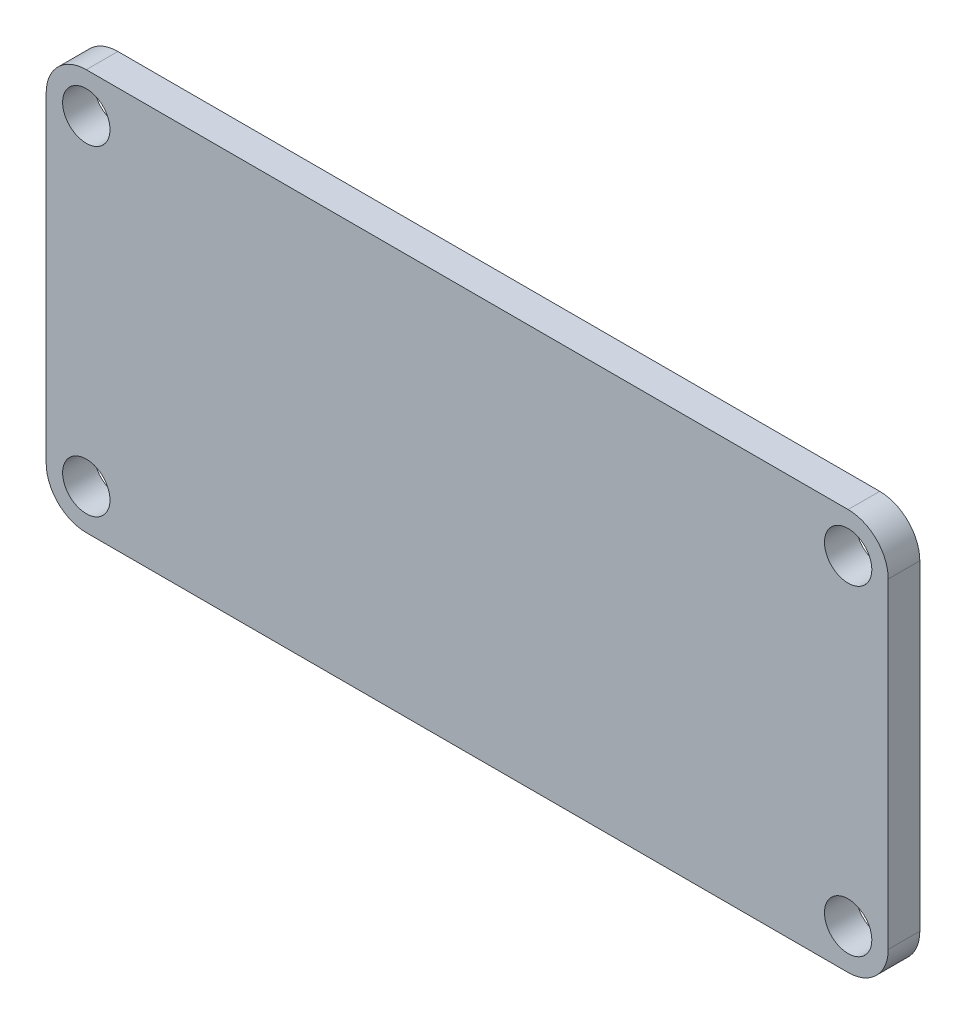
ISO-10303-21;
HEADER;
FILE_DESCRIPTION(('STEP AP214'),'2;1');
FILE_NAME('part.step','',(''),(''),'','','');
FILE_SCHEMA(('AUTOMOTIVE_DESIGN { 1 0 10303 214 1 1 1 1 }'));
ENDSEC;
DATA;
#1=APPLICATION_CONTEXT('core data for automotive mechanical design processes');
#2=APPLICATION_PROTOCOL_DEFINITION('international standard','automotive_design',2000,#1);
#3=PRODUCT_CONTEXT('',#1,'mechanical');
#4=PRODUCT('Part','Part','',(#3));
#5=PRODUCT_RELATED_PRODUCT_CATEGORY('part','',(#4));
#6=PRODUCT_DEFINITION_FORMATION('','',#4);
#7=PRODUCT_DEFINITION_CONTEXT('part definition',#1,'design');
#8=PRODUCT_DEFINITION('design','',#6,#7);
#9=PRODUCT_DEFINITION_SHAPE('','',#8);
#10=(LENGTH_UNIT() NAMED_UNIT(*) SI_UNIT(.MILLI.,.METRE.));
#11=(NAMED_UNIT(*) PLANE_ANGLE_UNIT() SI_UNIT($,.RADIAN.));
#12=(NAMED_UNIT(*) SI_UNIT($,.STERADIAN.) SOLID_ANGLE_UNIT());
#13=UNCERTAINTY_MEASURE_WITH_UNIT(LENGTH_MEASURE(1.E-05),#10,'distance_accuracy_value','');
#14=(GEOMETRIC_REPRESENTATION_CONTEXT(3) GLOBAL_UNCERTAINTY_ASSIGNED_CONTEXT((#13)) GLOBAL_UNIT_ASSIGNED_CONTEXT((#10,
#11,#12)) REPRESENTATION_CONTEXT('',''));
#15=CARTESIAN_POINT('',(0.,0.,0.));
#16=DIRECTION('',(0.,0.,1.));
#17=DIRECTION('',(1.,0.,0.));
#18=AXIS2_PLACEMENT_3D('',#15,#16,#17);
#19=CARTESIAN_POINT('',(50.8,22.86,2.));
#20=DIRECTION('',(0.,0.,-1.));
#21=DIRECTION('',(-1.,0.,0.));
#22=AXIS2_PLACEMENT_3D('',#19,#20,#21);
#23=PLANE('',#22);
#24=CARTESIAN_POINT('',(50.8,22.86,2.));
#25=DIRECTION('',(0.,0.,1.));
#26=DIRECTION('',(-1.,0.,0.));
#27=AXIS2_PLACEMENT_3D('',#24,#25,#26);
#28=CIRCLE('',#27,2.54);
#29=CARTESIAN_POINT('',(53.34,22.86,2.));
#30=VERTEX_POINT('',#29);
#31=CARTESIAN_POINT('',(50.8,25.4,2.));
#32=VERTEX_POINT('',#31);
#33=EDGE_CURVE('E164',#30,#32,#28,.T.);
#34=ORIENTED_EDGE('',*,*,#33,.T.);
#35=DIRECTION('',(-1.,0.,0.));
#36=VECTOR('',#35,1.);
#37=CARTESIAN_POINT('',(2.54,25.4,2.));
#38=LINE('',#37,#36);
#39=CARTESIAN_POINT('',(2.54,25.4,2.));
#40=VERTEX_POINT('',#39);
#41=EDGE_CURVE('E100',#32,#40,#38,.T.);
#42=ORIENTED_EDGE('',*,*,#41,.T.);
#43=CARTESIAN_POINT('',(2.54,22.86,2.));
#44=DIRECTION('',(0.,0.,1.));
#45=DIRECTION('',(-1.,0.,0.));
#46=AXIS2_PLACEMENT_3D('',#43,#44,#45);
#47=CIRCLE('',#46,2.54);
#48=CARTESIAN_POINT('',(0.,22.86,2.));
#49=VERTEX_POINT('',#48);
#50=EDGE_CURVE('E185',#40,#49,#47,.T.);
#51=ORIENTED_EDGE('',*,*,#50,.T.);
#52=DIRECTION('',(0.,-1.,0.));
#53=VECTOR('',#52,1.);
#54=CARTESIAN_POINT('',(0.,2.54000000000002,2.));
#55=LINE('',#54,#53);
#56=CARTESIAN_POINT('',(0.,2.54000000000002,2.));
#57=VERTEX_POINT('',#56);
#58=EDGE_CURVE('E199',#49,#57,#55,.T.);
#59=ORIENTED_EDGE('',*,*,#58,.T.);
#60=CARTESIAN_POINT('',(2.54,2.54,2.));
#61=DIRECTION('',(0.,0.,1.));
#62=DIRECTION('',(1.,0.,0.));
#63=AXIS2_PLACEMENT_3D('',#60,#61,#62);
#64=CIRCLE('',#63,2.54);
#65=CARTESIAN_POINT('',(2.54000000000002,0.,2.));
#66=VERTEX_POINT('',#65);
#67=EDGE_CURVE('E119',#57,#66,#64,.T.);
#68=ORIENTED_EDGE('',*,*,#67,.T.);
#69=DIRECTION('',(1.,0.,0.));
#70=VECTOR('',#69,1.);
#71=CARTESIAN_POINT('',(2.54000000000002,0.,2.));
#72=LINE('',#71,#70);
#73=CARTESIAN_POINT('',(50.8,0.,2.));
#74=VERTEX_POINT('',#73);
#75=EDGE_CURVE('E113',#66,#74,#72,.T.);
#76=ORIENTED_EDGE('',*,*,#75,.T.);
#77=CARTESIAN_POINT('',(50.8,2.54,2.));
#78=DIRECTION('',(0.,0.,1.));
#79=DIRECTION('',(-1.,0.,0.));
#80=AXIS2_PLACEMENT_3D('',#77,#78,#79);
#81=CIRCLE('',#80,2.54);
#82=CARTESIAN_POINT('',(53.34,2.54,2.));
#83=VERTEX_POINT('',#82);
#84=EDGE_CURVE('E117',#74,#83,#81,.T.);
#85=ORIENTED_EDGE('',*,*,#84,.T.);
#86=DIRECTION('',(0.,1.,0.));
#87=VECTOR('',#86,1.);
#88=CARTESIAN_POINT('',(53.34,2.54,2.));
#89=LINE('',#88,#87);
#90=EDGE_CURVE('E57',#83,#30,#89,.T.);
#91=ORIENTED_EDGE('',*,*,#90,.T.);
#92=EDGE_LOOP('',(#34,#42,#51,#59,#68,#76,#85,#91));
#93=FACE_BOUND('',#92,.T.);
#94=CARTESIAN_POINT('',(50.8,22.86,2.));
#95=DIRECTION('',(0.,0.,1.));
#96=DIRECTION('',(1.,0.,0.));
#97=AXIS2_PLACEMENT_3D('',#94,#95,#96);
#98=CIRCLE('',#97,1.5);
#99=CARTESIAN_POINT('',(52.3,22.86,2.));
#100=VERTEX_POINT('',#99);
#101=EDGE_CURVE('E146',#100,#100,#98,.T.);
#102=ORIENTED_EDGE('',*,*,#101,.F.);
#103=EDGE_LOOP('',(#102));
#104=FACE_BOUND('',#103,.T.);
#105=CARTESIAN_POINT('',(2.54,22.86,2.));
#106=DIRECTION('',(0.,0.,1.));
#107=DIRECTION('',(1.,0.,0.));
#108=AXIS2_PLACEMENT_3D('',#105,#106,#107);
#109=CIRCLE('',#108,1.5);
#110=CARTESIAN_POINT('',(4.04,22.86,2.));
#111=VERTEX_POINT('',#110);
#112=EDGE_CURVE('E213',#111,#111,#109,.T.);
#113=ORIENTED_EDGE('',*,*,#112,.F.);
#114=EDGE_LOOP('',(#113));
#115=FACE_BOUND('',#114,.T.);
#116=CARTESIAN_POINT('',(50.8,2.54,2.));
#117=DIRECTION('',(0.,0.,1.));
#118=DIRECTION('',(1.,0.,0.));
#119=AXIS2_PLACEMENT_3D('',#116,#117,#118);
#120=CIRCLE('',#119,1.5);
#121=CARTESIAN_POINT('',(52.3,2.54,2.));
#122=VERTEX_POINT('',#121);
#123=EDGE_CURVE('E221',#122,#122,#120,.T.);
#124=ORIENTED_EDGE('',*,*,#123,.F.);
#125=EDGE_LOOP('',(#124));
#126=FACE_BOUND('',#125,.T.);
#127=CARTESIAN_POINT('',(2.54,2.54,2.));
#128=DIRECTION('',(0.,0.,1.));
#129=DIRECTION('',(1.,0.,0.));
#130=AXIS2_PLACEMENT_3D('',#127,#128,#129);
#131=CIRCLE('',#130,1.5);
#132=CARTESIAN_POINT('',(4.04,2.54,2.));
#133=VERTEX_POINT('',#132);
#134=EDGE_CURVE('E229',#133,#133,#131,.T.);
#135=ORIENTED_EDGE('',*,*,#134,.F.);
#136=EDGE_LOOP('',(#135));
#137=FACE_BOUND('',#136,.T.);
#138=ADVANCED_FACE('F39',(#93,#104,#115,#126,#137),#23,.F.);
#139=CARTESIAN_POINT('',(50.8,22.86,0.));
#140=DIRECTION('',(0.,0.,-1.));
#141=DIRECTION('',(-1.,0.,0.));
#142=AXIS2_PLACEMENT_3D('',#139,#140,#141);
#143=PLANE('',#142);
#144=CARTESIAN_POINT('',(50.8,2.54,0.));
#145=DIRECTION('',(0.,0.,1.));
#146=DIRECTION('',(1.,0.,0.));
#147=AXIS2_PLACEMENT_3D('',#144,#145,#146);
#148=CIRCLE('',#147,1.5);
#149=CARTESIAN_POINT('',(52.3,2.54,0.));
#150=VERTEX_POINT('',#149);
#151=EDGE_CURVE('E225',#150,#150,#148,.T.);
#152=ORIENTED_EDGE('',*,*,#151,.T.);
#153=EDGE_LOOP('',(#152));
#154=FACE_BOUND('',#153,.T.);
#155=CARTESIAN_POINT('',(50.8,22.86,0.));
#156=DIRECTION('',(0.,0.,1.));
#157=DIRECTION('',(1.,0.,0.));
#158=AXIS2_PLACEMENT_3D('',#155,#156,#157);
#159=CIRCLE('',#158,1.5);
#160=CARTESIAN_POINT('',(52.3,22.86,0.));
#161=VERTEX_POINT('',#160);
#162=EDGE_CURVE('E209',#161,#161,#159,.T.);
#163=ORIENTED_EDGE('',*,*,#162,.T.);
#164=EDGE_LOOP('',(#163));
#165=FACE_BOUND('',#164,.T.);
#166=CARTESIAN_POINT('',(50.8,22.86,0.));
#167=DIRECTION('',(0.,0.,1.));
#168=DIRECTION('',(-1.,0.,0.));
#169=AXIS2_PLACEMENT_3D('',#166,#167,#168);
#170=CIRCLE('',#169,2.54);
#171=CARTESIAN_POINT('',(53.34,22.86,0.));
#172=VERTEX_POINT('',#171);
#173=CARTESIAN_POINT('',(50.8,25.4,0.));
#174=VERTEX_POINT('',#173);
#175=EDGE_CURVE('E141',#172,#174,#170,.T.);
#176=ORIENTED_EDGE('',*,*,#175,.F.);
#177=DIRECTION('',(0.,1.,0.));
#178=VECTOR('',#177,1.);
#179=CARTESIAN_POINT('',(53.34,2.54,0.));
#180=LINE('',#179,#178);
#181=CARTESIAN_POINT('',(53.34,2.54,0.));
#182=VERTEX_POINT('',#181);
#183=EDGE_CURVE('E92',#182,#172,#180,.T.);
#184=ORIENTED_EDGE('',*,*,#183,.F.);
#185=CARTESIAN_POINT('',(50.8,2.54,0.));
#186=DIRECTION('',(0.,0.,1.));
#187=DIRECTION('',(-1.,0.,0.));
#188=AXIS2_PLACEMENT_3D('',#185,#186,#187);
#189=CIRCLE('',#188,2.54);
#190=CARTESIAN_POINT('',(50.8,0.,0.));
#191=VERTEX_POINT('',#190);
#192=EDGE_CURVE('E86',#191,#182,#189,.T.);
#193=ORIENTED_EDGE('',*,*,#192,.F.);
#194=DIRECTION('',(1.,0.,0.));
#195=VECTOR('',#194,1.);
#196=CARTESIAN_POINT('',(2.54000000000002,0.,0.));
#197=LINE('',#196,#195);
#198=CARTESIAN_POINT('',(2.54000000000002,0.,0.));
#199=VERTEX_POINT('',#198);
#200=EDGE_CURVE('E128',#199,#191,#197,.T.);
#201=ORIENTED_EDGE('',*,*,#200,.F.);
#202=CARTESIAN_POINT('',(2.54,2.54,0.));
#203=DIRECTION('',(0.,0.,1.));
#204=DIRECTION('',(1.,0.,0.));
#205=AXIS2_PLACEMENT_3D('',#202,#203,#204);
#206=CIRCLE('',#205,2.54);
#207=CARTESIAN_POINT('',(0.,2.54000000000002,0.));
#208=VERTEX_POINT('',#207);
#209=EDGE_CURVE('E155',#208,#199,#206,.T.);
#210=ORIENTED_EDGE('',*,*,#209,.F.);
#211=DIRECTION('',(0.,-1.,0.));
#212=VECTOR('',#211,1.);
#213=CARTESIAN_POINT('',(0.,2.54000000000002,0.));
#214=LINE('',#213,#212);
#215=CARTESIAN_POINT('',(0.,22.86,0.));
#216=VERTEX_POINT('',#215);
#217=EDGE_CURVE('E152',#216,#208,#214,.T.);
#218=ORIENTED_EDGE('',*,*,#217,.F.);
#219=CARTESIAN_POINT('',(2.54,22.86,0.));
#220=DIRECTION('',(0.,0.,1.));
#221=DIRECTION('',(-1.,0.,0.));
#222=AXIS2_PLACEMENT_3D('',#219,#220,#221);
#223=CIRCLE('',#222,2.54);
#224=CARTESIAN_POINT('',(2.54,25.4,0.));
#225=VERTEX_POINT('',#224);
#226=EDGE_CURVE('E149',#225,#216,#223,.T.);
#227=ORIENTED_EDGE('',*,*,#226,.F.);
#228=DIRECTION('',(-1.,0.,0.));
#229=VECTOR('',#228,1.);
#230=CARTESIAN_POINT('',(2.54,25.4,0.));
#231=LINE('',#230,#229);
#232=EDGE_CURVE('E145',#174,#225,#231,.T.);
#233=ORIENTED_EDGE('',*,*,#232,.F.);
#234=EDGE_LOOP('',(#176,#184,#193,#201,#210,#218,#227,#233));
#235=FACE_BOUND('',#234,.T.);
#236=CARTESIAN_POINT('',(2.54,22.86,0.));
#237=DIRECTION('',(0.,0.,1.));
#238=DIRECTION('',(1.,0.,0.));
#239=AXIS2_PLACEMENT_3D('',#236,#237,#238);
#240=CIRCLE('',#239,1.5);
#241=CARTESIAN_POINT('',(4.04,22.86,0.));
#242=VERTEX_POINT('',#241);
#243=EDGE_CURVE('E217',#242,#242,#240,.T.);
#244=ORIENTED_EDGE('',*,*,#243,.T.);
#245=EDGE_LOOP('',(#244));
#246=FACE_BOUND('',#245,.T.);
#247=CARTESIAN_POINT('',(2.54,2.54,0.));
#248=DIRECTION('',(0.,0.,1.));
#249=DIRECTION('',(1.,0.,0.));
#250=AXIS2_PLACEMENT_3D('',#247,#248,#249);
#251=CIRCLE('',#250,1.5);
#252=CARTESIAN_POINT('',(4.04,2.54,0.));
#253=VERTEX_POINT('',#252);
#254=EDGE_CURVE('E233',#253,#253,#251,.T.);
#255=ORIENTED_EDGE('',*,*,#254,.T.);
#256=EDGE_LOOP('',(#255));
#257=FACE_BOUND('',#256,.T.);
#258=ADVANCED_FACE('F189',(#154,#165,#235,#246,#257),#143,.T.);
#259=CARTESIAN_POINT('',(50.8,22.86,2.));
#260=DIRECTION('',(0.,0.,-1.));
#261=DIRECTION('',(-1.,0.,0.));
#262=AXIS2_PLACEMENT_3D('',#259,#260,#261);
#263=CYLINDRICAL_SURFACE('',#262,2.54);
#264=ORIENTED_EDGE('',*,*,#175,.T.);
#265=DIRECTION('',(0.,0.,-1.));
#266=VECTOR('',#265,1.);
#267=CARTESIAN_POINT('',(50.8,25.4,2.));
#268=LINE('',#267,#266);
#269=EDGE_CURVE('E11',#32,#174,#268,.T.);
#270=ORIENTED_EDGE('',*,*,#269,.F.);
#271=ORIENTED_EDGE('',*,*,#33,.F.);
#272=DIRECTION('',(0.,0.,-1.));
#273=VECTOR('',#272,1.);
#274=CARTESIAN_POINT('',(53.34,22.86,2.));
#275=LINE('',#274,#273);
#276=EDGE_CURVE('E137',#30,#172,#275,.T.);
#277=ORIENTED_EDGE('',*,*,#276,.T.);
#278=EDGE_LOOP('',(#264,#270,#271,#277));
#279=FACE_BOUND('',#278,.T.);
#280=ADVANCED_FACE('F41',(#279),#263,.T.);
#281=CARTESIAN_POINT('',(2.54,25.4,2.));
#282=DIRECTION('',(0.,-1.,0.));
#283=DIRECTION('',(0.,0.,-1.));
#284=AXIS2_PLACEMENT_3D('',#281,#282,#283);
#285=PLANE('',#284);
#286=ORIENTED_EDGE('',*,*,#232,.T.);
#287=DIRECTION('',(0.,0.,-1.));
#288=VECTOR('',#287,1.);
#289=CARTESIAN_POINT('',(2.54,25.4,2.));
#290=LINE('',#289,#288);
#291=EDGE_CURVE('E49',#40,#225,#290,.T.);
#292=ORIENTED_EDGE('',*,*,#291,.F.);
#293=ORIENTED_EDGE('',*,*,#41,.F.);
#294=ORIENTED_EDGE('',*,*,#269,.T.);
#295=EDGE_LOOP('',(#286,#292,#293,#294));
#296=FACE_BOUND('',#295,.T.);
#297=ADVANCED_FACE('F267',(#296),#285,.F.);
#298=CARTESIAN_POINT('',(2.54,22.86,2.));
#299=DIRECTION('',(0.,0.,-1.));
#300=DIRECTION('',(-1.,0.,0.));
#301=AXIS2_PLACEMENT_3D('',#298,#299,#300);
#302=CYLINDRICAL_SURFACE('',#301,2.54);
#303=ORIENTED_EDGE('',*,*,#226,.T.);
#304=DIRECTION('',(0.,0.,-1.));
#305=VECTOR('',#304,1.);
#306=CARTESIAN_POINT('',(0.,22.86,2.));
#307=LINE('',#306,#305);
#308=EDGE_CURVE('E175',#49,#216,#307,.T.);
#309=ORIENTED_EDGE('',*,*,#308,.F.);
#310=ORIENTED_EDGE('',*,*,#50,.F.);
#311=ORIENTED_EDGE('',*,*,#291,.T.);
#312=EDGE_LOOP('',(#303,#309,#310,#311));
#313=FACE_BOUND('',#312,.T.);
#314=ADVANCED_FACE('F183',(#313),#302,.T.);
#315=CARTESIAN_POINT('',(0.,2.54000000000002,2.));
#316=DIRECTION('',(1.,0.,0.));
#317=DIRECTION('',(0.,0.,-1.));
#318=AXIS2_PLACEMENT_3D('',#315,#316,#317);
#319=PLANE('',#318);
#320=ORIENTED_EDGE('',*,*,#217,.T.);
#321=DIRECTION('',(0.,0.,-1.));
#322=VECTOR('',#321,1.);
#323=CARTESIAN_POINT('',(0.,2.54000000000002,2.));
#324=LINE('',#323,#322);
#325=EDGE_CURVE('E171',#57,#208,#324,.T.);
#326=ORIENTED_EDGE('',*,*,#325,.F.);
#327=ORIENTED_EDGE('',*,*,#58,.F.);
#328=ORIENTED_EDGE('',*,*,#308,.T.);
#329=EDGE_LOOP('',(#320,#326,#327,#328));
#330=FACE_BOUND('',#329,.T.);
#331=ADVANCED_FACE('F194',(#330),#319,.F.);
#332=CARTESIAN_POINT('',(2.54,2.54,2.));
#333=DIRECTION('',(0.,0.,-1.));
#334=DIRECTION('',(-1.,0.,0.));
#335=AXIS2_PLACEMENT_3D('',#332,#333,#334);
#336=CYLINDRICAL_SURFACE('',#335,2.54);
#337=ORIENTED_EDGE('',*,*,#209,.T.);
#338=DIRECTION('',(0.,0.,-1.));
#339=VECTOR('',#338,1.);
#340=CARTESIAN_POINT('',(2.54000000000002,0.,2.));
#341=LINE('',#340,#339);
#342=EDGE_CURVE('E130',#66,#199,#341,.T.);
#343=ORIENTED_EDGE('',*,*,#342,.F.);
#344=ORIENTED_EDGE('',*,*,#67,.F.);
#345=ORIENTED_EDGE('',*,*,#325,.T.);
#346=EDGE_LOOP('',(#337,#343,#344,#345));
#347=FACE_BOUND('',#346,.T.);
#348=ADVANCED_FACE('F197',(#347),#336,.T.);
#349=CARTESIAN_POINT('',(2.54000000000002,0.,2.));
#350=DIRECTION('',(0.,1.,0.));
#351=DIRECTION('',(0.,0.,1.));
#352=AXIS2_PLACEMENT_3D('',#349,#350,#351);
#353=PLANE('',#352);
#354=ORIENTED_EDGE('',*,*,#200,.T.);
#355=DIRECTION('',(0.,0.,-1.));
#356=VECTOR('',#355,1.);
#357=CARTESIAN_POINT('',(50.8,0.,2.));
#358=LINE('',#357,#356);
#359=EDGE_CURVE('E125',#74,#191,#358,.T.);
#360=ORIENTED_EDGE('',*,*,#359,.F.);
#361=ORIENTED_EDGE('',*,*,#75,.F.);
#362=ORIENTED_EDGE('',*,*,#342,.T.);
#363=EDGE_LOOP('',(#354,#360,#361,#362));
#364=FACE_BOUND('',#363,.T.);
#365=ADVANCED_FACE('F126',(#364),#353,.F.);
#366=CARTESIAN_POINT('',(50.8,2.54,2.));
#367=DIRECTION('',(0.,0.,-1.));
#368=DIRECTION('',(-1.,0.,0.));
#369=AXIS2_PLACEMENT_3D('',#366,#367,#368);
#370=CYLINDRICAL_SURFACE('',#369,2.54);
#371=ORIENTED_EDGE('',*,*,#192,.T.);
#372=DIRECTION('',(0.,0.,-1.));
#373=VECTOR('',#372,1.);
#374=CARTESIAN_POINT('',(53.34,2.54,2.));
#375=LINE('',#374,#373);
#376=EDGE_CURVE('E131',#83,#182,#375,.T.);
#377=ORIENTED_EDGE('',*,*,#376,.F.);
#378=ORIENTED_EDGE('',*,*,#84,.F.);
#379=ORIENTED_EDGE('',*,*,#359,.T.);
#380=EDGE_LOOP('',(#371,#377,#378,#379));
#381=FACE_BOUND('',#380,.T.);
#382=ADVANCED_FACE('F133',(#381),#370,.T.);
#383=CARTESIAN_POINT('',(53.34,2.54,2.));
#384=DIRECTION('',(-1.,0.,0.));
#385=DIRECTION('',(0.,0.,1.));
#386=AXIS2_PLACEMENT_3D('',#383,#384,#385);
#387=PLANE('',#386);
#388=ORIENTED_EDGE('',*,*,#183,.T.);
#389=ORIENTED_EDGE('',*,*,#276,.F.);
#390=ORIENTED_EDGE('',*,*,#90,.F.);
#391=ORIENTED_EDGE('',*,*,#376,.T.);
#392=EDGE_LOOP('',(#388,#389,#390,#391));
#393=FACE_BOUND('',#392,.T.);
#394=ADVANCED_FACE('F255',(#393),#387,.F.);
#395=CARTESIAN_POINT('',(50.8,22.86,2.));
#396=DIRECTION('',(0.,0.,-1.));
#397=DIRECTION('',(-1.,0.,0.));
#398=AXIS2_PLACEMENT_3D('',#395,#396,#397);
#399=CYLINDRICAL_SURFACE('',#398,1.5);
#400=ORIENTED_EDGE('',*,*,#101,.T.);
#401=EDGE_LOOP('',(#400));
#402=FACE_BOUND('',#401,.T.);
#403=ORIENTED_EDGE('',*,*,#162,.F.);
#404=EDGE_LOOP('',(#403));
#405=FACE_BOUND('',#404,.T.);
#406=ADVANCED_FACE('F252',(#402,#405),#399,.F.);
#407=CARTESIAN_POINT('',(2.54,22.86,2.));
#408=DIRECTION('',(0.,0.,-1.));
#409=DIRECTION('',(-1.,0.,0.));
#410=AXIS2_PLACEMENT_3D('',#407,#408,#409);
#411=CYLINDRICAL_SURFACE('',#410,1.5);
#412=ORIENTED_EDGE('',*,*,#112,.T.);
#413=EDGE_LOOP('',(#412));
#414=FACE_BOUND('',#413,.T.);
#415=ORIENTED_EDGE('',*,*,#243,.F.);
#416=EDGE_LOOP('',(#415));
#417=FACE_BOUND('',#416,.T.);
#418=ADVANCED_FACE('F331',(#414,#417),#411,.F.);
#419=CARTESIAN_POINT('',(50.8,2.54,2.));
#420=DIRECTION('',(0.,0.,-1.));
#421=DIRECTION('',(-1.,0.,0.));
#422=AXIS2_PLACEMENT_3D('',#419,#420,#421);
#423=CYLINDRICAL_SURFACE('',#422,1.5);
#424=ORIENTED_EDGE('',*,*,#123,.T.);
#425=EDGE_LOOP('',(#424));
#426=FACE_BOUND('',#425,.T.);
#427=ORIENTED_EDGE('',*,*,#151,.F.);
#428=EDGE_LOOP('',(#427));
#429=FACE_BOUND('',#428,.T.);
#430=ADVANCED_FACE('F339',(#426,#429),#423,.F.);
#431=CARTESIAN_POINT('',(2.54,2.54,2.));
#432=DIRECTION('',(0.,0.,-1.));
#433=DIRECTION('',(-1.,0.,0.));
#434=AXIS2_PLACEMENT_3D('',#431,#432,#433);
#435=CYLINDRICAL_SURFACE('',#434,1.5);
#436=ORIENTED_EDGE('',*,*,#134,.T.);
#437=EDGE_LOOP('',(#436));
#438=FACE_BOUND('',#437,.T.);
#439=ORIENTED_EDGE('',*,*,#254,.F.);
#440=EDGE_LOOP('',(#439));
#441=FACE_BOUND('',#440,.T.);
#442=ADVANCED_FACE('F241',(#438,#441),#435,.F.);
#443=CLOSED_SHELL('',(#138,#258,#280,#297,#314,#331,#348,#365,#382,#394,#406,#418,#430,#442));
#444=MANIFOLD_SOLID_BREP('B2',#443);
#445=ADVANCED_BREP_SHAPE_REPRESENTATION('',(#18,#444),#14);
#446=SHAPE_DEFINITION_REPRESENTATION(#9,#445);
ENDSEC;
END-ISO-10303-21;
